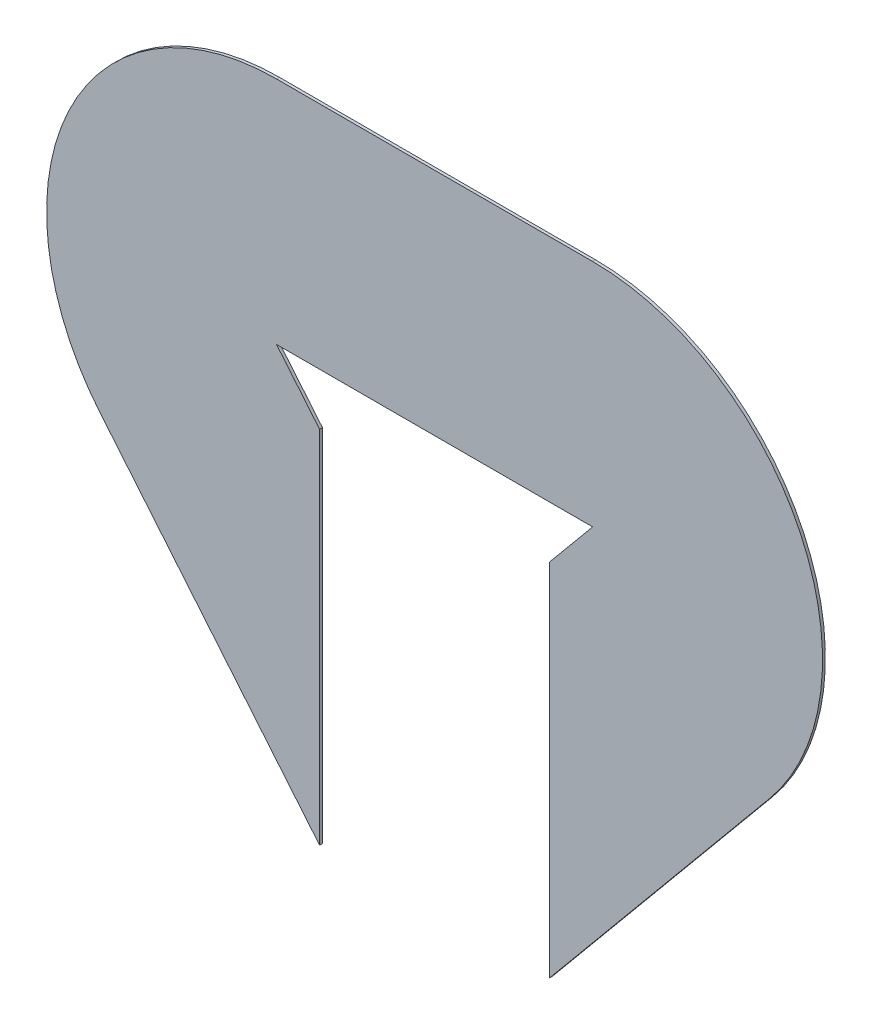
ISO-10303-21;
HEADER;
FILE_DESCRIPTION(('STEP AP214'),'2;1');
FILE_NAME('part.step','',(''),(''),'','','');
FILE_SCHEMA(('AUTOMOTIVE_DESIGN { 1 0 10303 214 1 1 1 1 }'));
ENDSEC;
DATA;
#1=APPLICATION_CONTEXT('core data for automotive mechanical design processes');
#2=APPLICATION_PROTOCOL_DEFINITION('international standard','automotive_design',2000,#1);
#3=PRODUCT_CONTEXT('',#1,'mechanical');
#4=PRODUCT('Part','Part','',(#3));
#5=PRODUCT_RELATED_PRODUCT_CATEGORY('part','',(#4));
#6=PRODUCT_DEFINITION_FORMATION('','',#4);
#7=PRODUCT_DEFINITION_CONTEXT('part definition',#1,'design');
#8=PRODUCT_DEFINITION('design','',#6,#7);
#9=PRODUCT_DEFINITION_SHAPE('','',#8);
#10=(LENGTH_UNIT() NAMED_UNIT(*) SI_UNIT(.MILLI.,.METRE.));
#11=(NAMED_UNIT(*) PLANE_ANGLE_UNIT() SI_UNIT($,.RADIAN.));
#12=(NAMED_UNIT(*) SI_UNIT($,.STERADIAN.) SOLID_ANGLE_UNIT());
#13=UNCERTAINTY_MEASURE_WITH_UNIT(LENGTH_MEASURE(1.E-05),#10,'distance_accuracy_value','');
#14=(GEOMETRIC_REPRESENTATION_CONTEXT(3) GLOBAL_UNCERTAINTY_ASSIGNED_CONTEXT((#13)) GLOBAL_UNIT_ASSIGNED_CONTEXT((#10,
#11,#12)) REPRESENTATION_CONTEXT('',''));
#15=CARTESIAN_POINT('',(0.,0.,0.));
#16=DIRECTION('',(0.,0.,1.));
#17=DIRECTION('',(1.,0.,0.));
#18=AXIS2_PLACEMENT_3D('',#15,#16,#17);
#19=CARTESIAN_POINT('',(1.3700096408501,169.165015451123,2.54));
#20=DIRECTION('',(0.,0.,-1.));
#21=DIRECTION('',(-1.,0.,0.));
#22=AXIS2_PLACEMENT_3D('',#19,#20,#21);
#23=CYLINDRICAL_SURFACE('',#22,203.2);
#24=CARTESIAN_POINT('',(1.3700096408501,169.165015451123,0.));
#25=DIRECTION('',(0.,0.,1.));
#26=DIRECTION('',(1.,0.,0.));
#27=AXIS2_PLACEMENT_3D('',#24,#25,#26);
#28=CIRCLE('',#27,203.2);
#29=CARTESIAN_POINT('',(1.3700096408508,372.365015451122,0.));
#30=VERTEX_POINT('',#29);
#31=CARTESIAN_POINT('',(-155.062591517445,39.476614678926,0.));
#32=VERTEX_POINT('',#31);
#33=EDGE_CURVE('E152',#30,#32,#28,.T.);
#34=ORIENTED_EDGE('',*,*,#33,.T.);
#35=DIRECTION('',(0.,0.,-1.));
#36=VECTOR('',#35,1.);
#37=CARTESIAN_POINT('',(-155.062591517445,39.476614678926,2.54));
#38=LINE('',#37,#36);
#39=CARTESIAN_POINT('',(-155.062591517445,39.476614678926,2.54));
#40=VERTEX_POINT('',#39);
#41=EDGE_CURVE('E11',#40,#32,#38,.T.);
#42=ORIENTED_EDGE('',*,*,#41,.F.);
#43=CARTESIAN_POINT('',(1.3700096408501,169.165015451123,2.54));
#44=DIRECTION('',(0.,0.,1.));
#45=DIRECTION('',(1.,0.,0.));
#46=AXIS2_PLACEMENT_3D('',#43,#44,#45);
#47=CIRCLE('',#46,203.2);
#48=CARTESIAN_POINT('',(1.3700096408508,372.365015451122,2.54));
#49=VERTEX_POINT('',#48);
#50=EDGE_CURVE('E181',#49,#40,#47,.T.);
#51=ORIENTED_EDGE('',*,*,#50,.F.);
#52=DIRECTION('',(0.,0.,-1.));
#53=VECTOR('',#52,1.);
#54=CARTESIAN_POINT('',(1.3700096408508,372.365015451122,2.54));
#55=LINE('',#54,#53);
#56=EDGE_CURVE('E148',#49,#30,#55,.T.);
#57=ORIENTED_EDGE('',*,*,#56,.T.);
#58=EDGE_LOOP('',(#34,#42,#51,#57));
#59=FACE_BOUND('',#58,.T.);
#60=ADVANCED_FACE('F39',(#59),#23,.T.);
#61=CARTESIAN_POINT('',(-155.062591517445,39.476614678926,2.54));
#62=DIRECTION('',(0.769845478141215,0.638230318760809,0.));
#63=DIRECTION('',(-0.63823031876081,0.769845478141215,0.));
#64=AXIS2_PLACEMENT_3D('',#61,#62,#63);
#65=PLANE('',#64);
#66=DIRECTION('',(0.638230318760809,-0.769845478141215,0.));
#67=VECTOR('',#66,1.);
#68=CARTESIAN_POINT('',(-155.062591517445,39.476614678926,0.));
#69=LINE('',#68,#67);
#70=CARTESIAN_POINT('',(39.4700096408501,-195.172287058516,0.));
#71=VERTEX_POINT('',#70);
#72=EDGE_CURVE('E156',#32,#71,#69,.T.);
#73=ORIENTED_EDGE('',*,*,#72,.T.);
#74=DIRECTION('',(0.,0.,-1.));
#75=VECTOR('',#74,1.);
#76=CARTESIAN_POINT('',(39.4700096408501,-195.172287058516,2.54));
#77=LINE('',#76,#75);
#78=CARTESIAN_POINT('',(39.4700096408501,-195.172287058516,2.54));
#79=VERTEX_POINT('',#78);
#80=EDGE_CURVE('E48',#79,#71,#77,.T.);
#81=ORIENTED_EDGE('',*,*,#80,.F.);
#82=DIRECTION('',(0.638230318760809,-0.769845478141215,0.));
#83=VECTOR('',#82,1.);
#84=CARTESIAN_POINT('',(-155.062591517445,39.476614678926,2.54));
#85=LINE('',#84,#83);
#86=EDGE_CURVE('E105',#40,#79,#85,.T.);
#87=ORIENTED_EDGE('',*,*,#86,.F.);
#88=ORIENTED_EDGE('',*,*,#41,.T.);
#89=EDGE_LOOP('',(#73,#81,#87,#88));
#90=FACE_BOUND('',#89,.T.);
#91=ADVANCED_FACE('F244',(#90),#65,.F.);
#92=CARTESIAN_POINT('',(39.4700096408501,-195.172287058516,2.54));
#93=DIRECTION('',(-1.,0.,0.));
#94=DIRECTION('',(0.,0.,1.));
#95=AXIS2_PLACEMENT_3D('',#92,#93,#94);
#96=PLANE('',#95);
#97=DIRECTION('',(0.,1.,0.));
#98=VECTOR('',#97,1.);
#99=CARTESIAN_POINT('',(39.4700096408501,-195.172287058516,0.));
#100=LINE('',#99,#98);
#101=CARTESIAN_POINT('',(39.4700096408501,123.208075056737,0.));
#102=VERTEX_POINT('',#101);
#103=EDGE_CURVE('E159',#71,#102,#100,.T.);
#104=ORIENTED_EDGE('',*,*,#103,.T.);
#105=DIRECTION('',(0.,0.,-1.));
#106=VECTOR('',#105,1.);
#107=CARTESIAN_POINT('',(39.4700096408501,123.208075056737,2.54));
#108=LINE('',#107,#106);
#109=CARTESIAN_POINT('',(39.4700096408501,123.208075056737,2.54));
#110=VERTEX_POINT('',#109);
#111=EDGE_CURVE('E200',#110,#102,#108,.T.);
#112=ORIENTED_EDGE('',*,*,#111,.F.);
#113=DIRECTION('',(0.,1.,0.));
#114=VECTOR('',#113,1.);
#115=CARTESIAN_POINT('',(39.4700096408501,-195.172287058516,2.54));
#116=LINE('',#115,#114);
#117=EDGE_CURVE('E210',#79,#110,#116,.T.);
#118=ORIENTED_EDGE('',*,*,#117,.F.);
#119=ORIENTED_EDGE('',*,*,#80,.T.);
#120=EDGE_LOOP('',(#104,#112,#118,#119));
#121=FACE_BOUND('',#120,.T.);
#122=ADVANCED_FACE('F208',(#121),#96,.F.);
#123=CARTESIAN_POINT('',(1.3700096408501,169.165015451123,2.54));
#124=DIRECTION('',(-0.769845478141215,-0.63823031876081,0.));
#125=DIRECTION('',(0.63823031876081,-0.769845478141215,0.));
#126=AXIS2_PLACEMENT_3D('',#123,#124,#125);
#127=PLANE('',#126);
#128=DIRECTION('',(-0.63823031876081,0.769845478141215,0.));
#129=VECTOR('',#128,1.);
#130=CARTESIAN_POINT('',(1.3700096408501,169.165015451123,0.));
#131=LINE('',#130,#129);
#132=CARTESIAN_POINT('',(1.3700096408501,169.165015451123,0.));
#133=VERTEX_POINT('',#132);
#134=EDGE_CURVE('E162',#102,#133,#131,.T.);
#135=ORIENTED_EDGE('',*,*,#134,.T.);
#136=DIRECTION('',(0.,0.,-1.));
#137=VECTOR('',#136,1.);
#138=CARTESIAN_POINT('',(1.3700096408501,169.165015451123,2.54));
#139=LINE('',#138,#137);
#140=CARTESIAN_POINT('',(1.3700096408501,169.165015451123,2.54));
#141=VERTEX_POINT('',#140);
#142=EDGE_CURVE('E196',#141,#133,#139,.T.);
#143=ORIENTED_EDGE('',*,*,#142,.F.);
#144=DIRECTION('',(-0.63823031876081,0.769845478141215,0.));
#145=VECTOR('',#144,1.);
#146=CARTESIAN_POINT('',(1.3700096408501,169.165015451123,2.54));
#147=LINE('',#146,#145);
#148=EDGE_CURVE('E228',#110,#141,#147,.T.);
#149=ORIENTED_EDGE('',*,*,#148,.F.);
#150=ORIENTED_EDGE('',*,*,#111,.T.);
#151=EDGE_LOOP('',(#135,#143,#149,#150));
#152=FACE_BOUND('',#151,.T.);
#153=ADVANCED_FACE('F218',(#152),#127,.F.);
#154=CARTESIAN_POINT('',(280.77000964085,169.165015451123,2.54));
#155=DIRECTION('',(0.,1.,0.));
#156=DIRECTION('',(0.,0.,1.));
#157=AXIS2_PLACEMENT_3D('',#154,#155,#156);
#158=PLANE('',#157);
#159=DIRECTION('',(1.,0.,0.));
#160=VECTOR('',#159,1.);
#161=CARTESIAN_POINT('',(280.77000964085,169.165015451123,0.));
#162=LINE('',#161,#160);
#163=CARTESIAN_POINT('',(280.77000964085,169.165015451123,0.));
#164=VERTEX_POINT('',#163);
#165=EDGE_CURVE('E166',#133,#164,#162,.T.);
#166=ORIENTED_EDGE('',*,*,#165,.T.);
#167=DIRECTION('',(0.,0.,-1.));
#168=VECTOR('',#167,1.);
#169=CARTESIAN_POINT('',(280.77000964085,169.165015451123,2.54));
#170=LINE('',#169,#168);
#171=CARTESIAN_POINT('',(280.77000964085,169.165015451123,2.54));
#172=VERTEX_POINT('',#171);
#173=EDGE_CURVE('E192',#172,#164,#170,.T.);
#174=ORIENTED_EDGE('',*,*,#173,.F.);
#175=DIRECTION('',(1.,0.,0.));
#176=VECTOR('',#175,1.);
#177=CARTESIAN_POINT('',(1.3700096408501,169.165015451123,2.54));
#178=LINE('',#177,#176);
#179=EDGE_CURVE('E224',#141,#172,#178,.T.);
#180=ORIENTED_EDGE('',*,*,#179,.F.);
#181=ORIENTED_EDGE('',*,*,#142,.T.);
#182=EDGE_LOOP('',(#166,#174,#180,#181));
#183=FACE_BOUND('',#182,.T.);
#184=ADVANCED_FACE('F222',(#183),#158,.F.);
#185=CARTESIAN_POINT('',(280.77000964085,169.165015451123,2.54));
#186=DIRECTION('',(0.769845478141215,-0.63823031876081,0.));
#187=DIRECTION('',(0.63823031876081,0.769845478141215,0.));
#188=AXIS2_PLACEMENT_3D('',#185,#186,#187);
#189=PLANE('',#188);
#190=DIRECTION('',(-0.638230318760809,-0.769845478141215,0.));
#191=VECTOR('',#190,1.);
#192=CARTESIAN_POINT('',(280.77000964085,169.165015451123,0.));
#193=LINE('',#192,#191);
#194=CARTESIAN_POINT('',(242.67000964085,123.208075056737,0.));
#195=VERTEX_POINT('',#194);
#196=EDGE_CURVE('E169',#164,#195,#193,.T.);
#197=ORIENTED_EDGE('',*,*,#196,.T.);
#198=DIRECTION('',(0.,0.,-1.));
#199=VECTOR('',#198,1.);
#200=CARTESIAN_POINT('',(242.67000964085,123.208075056737,2.54));
#201=LINE('',#200,#199);
#202=CARTESIAN_POINT('',(242.67000964085,123.208075056737,2.54));
#203=VERTEX_POINT('',#202);
#204=EDGE_CURVE('E188',#203,#195,#201,.T.);
#205=ORIENTED_EDGE('',*,*,#204,.F.);
#206=DIRECTION('',(-0.638230318760809,-0.769845478141215,0.));
#207=VECTOR('',#206,1.);
#208=CARTESIAN_POINT('',(280.77000964085,169.165015451123,2.54));
#209=LINE('',#208,#207);
#210=EDGE_CURVE('E227',#172,#203,#209,.T.);
#211=ORIENTED_EDGE('',*,*,#210,.F.);
#212=ORIENTED_EDGE('',*,*,#173,.T.);
#213=EDGE_LOOP('',(#197,#205,#211,#212));
#214=FACE_BOUND('',#213,.T.);
#215=ADVANCED_FACE('F256',(#214),#189,.F.);
#216=CARTESIAN_POINT('',(242.67000964085,-195.172287058516,2.54));
#217=DIRECTION('',(1.,0.,0.));
#218=DIRECTION('',(0.,0.,-1.));
#219=AXIS2_PLACEMENT_3D('',#216,#217,#218);
#220=PLANE('',#219);
#221=DIRECTION('',(0.,-1.,0.));
#222=VECTOR('',#221,1.);
#223=CARTESIAN_POINT('',(242.67000964085,-195.172287058516,0.));
#224=LINE('',#223,#222);
#225=CARTESIAN_POINT('',(242.67000964085,-195.172287058516,0.));
#226=VERTEX_POINT('',#225);
#227=EDGE_CURVE('E172',#195,#226,#224,.T.);
#228=ORIENTED_EDGE('',*,*,#227,.T.);
#229=DIRECTION('',(0.,0.,-1.));
#230=VECTOR('',#229,1.);
#231=CARTESIAN_POINT('',(242.67000964085,-195.172287058516,2.54));
#232=LINE('',#231,#230);
#233=CARTESIAN_POINT('',(242.67000964085,-195.172287058516,2.54));
#234=VERTEX_POINT('',#233);
#235=EDGE_CURVE('E141',#234,#226,#232,.T.);
#236=ORIENTED_EDGE('',*,*,#235,.F.);
#237=DIRECTION('',(0.,-1.,0.));
#238=VECTOR('',#237,1.);
#239=CARTESIAN_POINT('',(242.67000964085,-195.172287058516,2.54));
#240=LINE('',#239,#238);
#241=EDGE_CURVE('E130',#203,#234,#240,.T.);
#242=ORIENTED_EDGE('',*,*,#241,.F.);
#243=ORIENTED_EDGE('',*,*,#204,.T.);
#244=EDGE_LOOP('',(#228,#236,#242,#243));
#245=FACE_BOUND('',#244,.T.);
#246=ADVANCED_FACE('F259',(#245),#220,.F.);
#247=CARTESIAN_POINT('',(242.67000964085,-195.172287058516,2.54));
#248=DIRECTION('',(-0.769845478141215,0.63823031876081,0.));
#249=DIRECTION('',(-0.63823031876081,-0.769845478141215,0.));
#250=AXIS2_PLACEMENT_3D('',#247,#248,#249);
#251=PLANE('',#250);
#252=DIRECTION('',(0.63823031876081,0.769845478141215,0.));
#253=VECTOR('',#252,1.);
#254=CARTESIAN_POINT('',(242.67000964085,-195.172287058516,0.));
#255=LINE('',#254,#253);
#256=CARTESIAN_POINT('',(437.202610799145,39.476614678926,0.));
#257=VERTEX_POINT('',#256);
#258=EDGE_CURVE('E139',#226,#257,#255,.T.);
#259=ORIENTED_EDGE('',*,*,#258,.T.);
#260=DIRECTION('',(0.,0.,-1.));
#261=VECTOR('',#260,1.);
#262=CARTESIAN_POINT('',(437.202610799145,39.476614678926,2.54));
#263=LINE('',#262,#261);
#264=CARTESIAN_POINT('',(437.202610799145,39.476614678926,2.54));
#265=VERTEX_POINT('',#264);
#266=EDGE_CURVE('E136',#265,#257,#263,.T.);
#267=ORIENTED_EDGE('',*,*,#266,.F.);
#268=DIRECTION('',(0.63823031876081,0.769845478141215,0.));
#269=VECTOR('',#268,1.);
#270=CARTESIAN_POINT('',(242.67000964085,-195.172287058516,2.54));
#271=LINE('',#270,#269);
#272=EDGE_CURVE('E124',#234,#265,#271,.T.);
#273=ORIENTED_EDGE('',*,*,#272,.F.);
#274=ORIENTED_EDGE('',*,*,#235,.T.);
#275=EDGE_LOOP('',(#259,#267,#273,#274));
#276=FACE_BOUND('',#275,.T.);
#277=ADVANCED_FACE('F137',(#276),#251,.F.);
#278=CARTESIAN_POINT('',(280.77000964085,169.165015451123,2.54));
#279=DIRECTION('',(0.,0.,-1.));
#280=DIRECTION('',(-1.,0.,0.));
#281=AXIS2_PLACEMENT_3D('',#278,#279,#280);
#282=CYLINDRICAL_SURFACE('',#281,203.2);
#283=CARTESIAN_POINT('',(280.77000964085,169.165015451123,0.));
#284=DIRECTION('',(0.,0.,1.));
#285=DIRECTION('',(-1.,0.,0.));
#286=AXIS2_PLACEMENT_3D('',#283,#284,#285);
#287=CIRCLE('',#286,203.2);
#288=CARTESIAN_POINT('',(280.770009640851,372.365015451122,0.));
#289=VERTEX_POINT('',#288);
#290=EDGE_CURVE('E91',#257,#289,#287,.T.);
#291=ORIENTED_EDGE('',*,*,#290,.T.);
#292=DIRECTION('',(0.,0.,-1.));
#293=VECTOR('',#292,1.);
#294=CARTESIAN_POINT('',(280.770009640851,372.365015451122,2.54));
#295=LINE('',#294,#293);
#296=CARTESIAN_POINT('',(280.770009640851,372.365015451122,2.54));
#297=VERTEX_POINT('',#296);
#298=EDGE_CURVE('E142',#297,#289,#295,.T.);
#299=ORIENTED_EDGE('',*,*,#298,.F.);
#300=CARTESIAN_POINT('',(280.77000964085,169.165015451123,2.54));
#301=DIRECTION('',(0.,0.,1.));
#302=DIRECTION('',(-1.,0.,0.));
#303=AXIS2_PLACEMENT_3D('',#300,#301,#302);
#304=CIRCLE('',#303,203.2);
#305=EDGE_CURVE('E128',#265,#297,#304,.T.);
#306=ORIENTED_EDGE('',*,*,#305,.F.);
#307=ORIENTED_EDGE('',*,*,#266,.T.);
#308=EDGE_LOOP('',(#291,#299,#306,#307));
#309=FACE_BOUND('',#308,.T.);
#310=ADVANCED_FACE('F144',(#309),#282,.T.);
#311=CARTESIAN_POINT('',(1.3700096408508,372.365015451122,2.54));
#312=DIRECTION('',(0.,-1.,0.));
#313=DIRECTION('',(0.,0.,-1.));
#314=AXIS2_PLACEMENT_3D('',#311,#312,#313);
#315=PLANE('',#314);
#316=DIRECTION('',(-1.,0.,0.));
#317=VECTOR('',#316,1.);
#318=CARTESIAN_POINT('',(1.3700096408508,372.365015451122,0.));
#319=LINE('',#318,#317);
#320=EDGE_CURVE('E97',#289,#30,#319,.T.);
#321=ORIENTED_EDGE('',*,*,#320,.T.);
#322=ORIENTED_EDGE('',*,*,#56,.F.);
#323=DIRECTION('',(-1.,0.,0.));
#324=VECTOR('',#323,1.);
#325=CARTESIAN_POINT('',(1.3700096408508,372.365015451122,2.54));
#326=LINE('',#325,#324);
#327=EDGE_CURVE('E56',#297,#49,#326,.T.);
#328=ORIENTED_EDGE('',*,*,#327,.F.);
#329=ORIENTED_EDGE('',*,*,#298,.T.);
#330=EDGE_LOOP('',(#321,#322,#328,#329));
#331=FACE_BOUND('',#330,.T.);
#332=ADVANCED_FACE('F268',(#331),#315,.F.);
#333=CARTESIAN_POINT('',(1.3700096408501,169.165015451123,2.54));
#334=DIRECTION('',(0.,0.,1.));
#335=DIRECTION('',(1.,0.,0.));
#336=AXIS2_PLACEMENT_3D('',#333,#334,#335);
#337=PLANE('',#336);
#338=ORIENTED_EDGE('',*,*,#50,.T.);
#339=ORIENTED_EDGE('',*,*,#86,.T.);
#340=ORIENTED_EDGE('',*,*,#117,.T.);
#341=ORIENTED_EDGE('',*,*,#148,.T.);
#342=ORIENTED_EDGE('',*,*,#179,.T.);
#343=ORIENTED_EDGE('',*,*,#210,.T.);
#344=ORIENTED_EDGE('',*,*,#241,.T.);
#345=ORIENTED_EDGE('',*,*,#272,.T.);
#346=ORIENTED_EDGE('',*,*,#305,.T.);
#347=ORIENTED_EDGE('',*,*,#327,.T.);
#348=EDGE_LOOP('',(#338,#339,#340,#341,#342,#343,#344,#345,#346,#347));
#349=FACE_BOUND('',#348,.T.);
#350=ADVANCED_FACE('F126',(#349),#337,.T.);
#351=CARTESIAN_POINT('',(1.3700096408501,169.165015451123,0.));
#352=DIRECTION('',(0.,0.,1.));
#353=DIRECTION('',(1.,0.,0.));
#354=AXIS2_PLACEMENT_3D('',#351,#352,#353);
#355=PLANE('',#354);
#356=ORIENTED_EDGE('',*,*,#33,.F.);
#357=ORIENTED_EDGE('',*,*,#320,.F.);
#358=ORIENTED_EDGE('',*,*,#290,.F.);
#359=ORIENTED_EDGE('',*,*,#258,.F.);
#360=ORIENTED_EDGE('',*,*,#227,.F.);
#361=ORIENTED_EDGE('',*,*,#196,.F.);
#362=ORIENTED_EDGE('',*,*,#165,.F.);
#363=ORIENTED_EDGE('',*,*,#134,.F.);
#364=ORIENTED_EDGE('',*,*,#103,.F.);
#365=ORIENTED_EDGE('',*,*,#72,.F.);
#366=EDGE_LOOP('',(#356,#357,#358,#359,#360,#361,#362,#363,#364,#365));
#367=FACE_BOUND('',#366,.T.);
#368=ADVANCED_FACE('F214',(#367),#355,.F.);
#369=CLOSED_SHELL('',(#60,#91,#122,#153,#184,#215,#246,#277,#310,#332,#350,#368));
#370=MANIFOLD_SOLID_BREP('B2',#369);
#371=ADVANCED_BREP_SHAPE_REPRESENTATION('',(#18,#370),#14);
#372=SHAPE_DEFINITION_REPRESENTATION(#9,#371);
ENDSEC;
END-ISO-10303-21;
